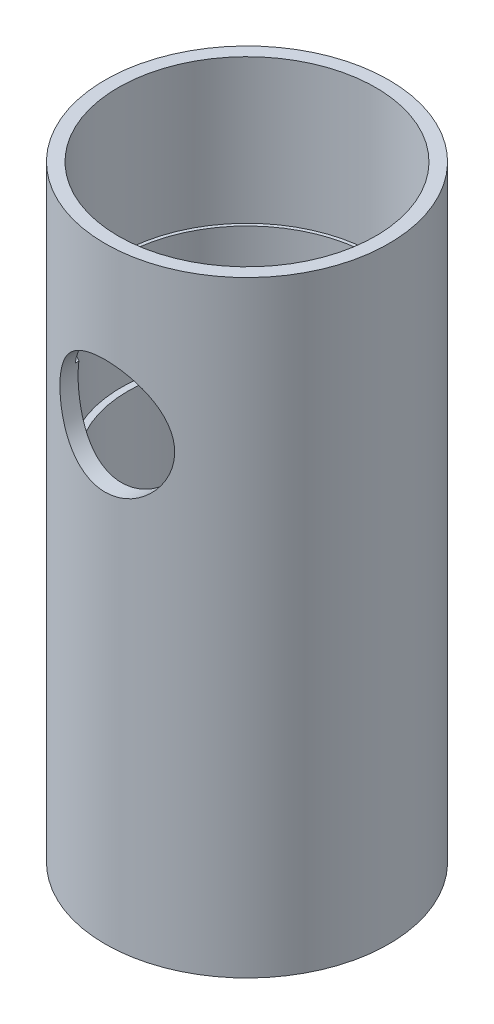
ISO-10303-21;
HEADER;
FILE_DESCRIPTION(('STEP AP214'),'2;1');
FILE_NAME('part.step','',(''),(''),'','','');
FILE_SCHEMA(('AUTOMOTIVE_DESIGN { 1 0 10303 214 1 1 1 1 }'));
ENDSEC;
DATA;
#1=APPLICATION_CONTEXT('core data for automotive mechanical design processes');
#2=APPLICATION_PROTOCOL_DEFINITION('international standard','automotive_design',2000,#1);
#3=PRODUCT_CONTEXT('',#1,'mechanical');
#4=PRODUCT('Part','Part','',(#3));
#5=PRODUCT_RELATED_PRODUCT_CATEGORY('part','',(#4));
#6=PRODUCT_DEFINITION_FORMATION('','',#4);
#7=PRODUCT_DEFINITION_CONTEXT('part definition',#1,'design');
#8=PRODUCT_DEFINITION('design','',#6,#7);
#9=PRODUCT_DEFINITION_SHAPE('','',#8);
#10=(LENGTH_UNIT() NAMED_UNIT(*) SI_UNIT(.MILLI.,.METRE.));
#11=(NAMED_UNIT(*) PLANE_ANGLE_UNIT() SI_UNIT($,.RADIAN.));
#12=(NAMED_UNIT(*) SI_UNIT($,.STERADIAN.) SOLID_ANGLE_UNIT());
#13=UNCERTAINTY_MEASURE_WITH_UNIT(LENGTH_MEASURE(1.E-05),#10,'distance_accuracy_value','');
#14=(GEOMETRIC_REPRESENTATION_CONTEXT(3) GLOBAL_UNCERTAINTY_ASSIGNED_CONTEXT((#13)) GLOBAL_UNIT_ASSIGNED_CONTEXT((#10,
#11,#12)) REPRESENTATION_CONTEXT('',''));
#15=CARTESIAN_POINT('',(0.,0.,0.));
#16=DIRECTION('',(0.,0.,1.));
#17=DIRECTION('',(1.,0.,0.));
#18=AXIS2_PLACEMENT_3D('',#15,#16,#17);
#19=CARTESIAN_POINT('',(0.,92.5,0.));
#20=DIRECTION('',(0.,-1.,0.));
#21=DIRECTION('',(0.,0.,-1.));
#22=AXIS2_PLACEMENT_3D('',#19,#20,#21);
#23=CYLINDRICAL_SURFACE('',#22,38.25);
#24=CARTESIAN_POINT('',(0.,13.85,0.));
#25=DIRECTION('',(0.,-1.,0.));
#26=DIRECTION('',(0.,0.,-1.));
#27=AXIS2_PLACEMENT_3D('',#24,#25,#26);
#28=CIRCLE('',#27,38.25);
#29=CARTESIAN_POINT('',(0.,13.85,-38.25));
#30=VERTEX_POINT('',#29);
#31=EDGE_CURVE('E90',#30,#30,#28,.T.);
#32=ORIENTED_EDGE('',*,*,#31,.T.);
#33=EDGE_LOOP('',(#32));
#34=FACE_BOUND('',#33,.T.);
#35=CARTESIAN_POINT('',(0.,48.5,0.));
#36=DIRECTION('',(0.,1.,0.));
#37=DIRECTION('',(0.,0.,1.));
#38=AXIS2_PLACEMENT_3D('',#35,#36,#37);
#39=CIRCLE('',#38,38.25);
#40=CARTESIAN_POINT('',(17.0008088042893,48.5,34.2641941390718));
#41=VERTEX_POINT('',#40);
#42=CARTESIAN_POINT('',(-17.0008088042893,48.5,34.2641941390718));
#43=VERTEX_POINT('',#42);
#44=EDGE_CURVE('E84',#41,#43,#39,.T.);
#45=ORIENTED_EDGE('',*,*,#44,.T.);
#46=CARTESIAN_POINT('',(-17.0008088042893,48.5,34.2641941390718));
#47=CARTESIAN_POINT('',(-17.053307658475,48.2849354779542,34.2381435848934));
#48=CARTESIAN_POINT('',(-17.1017703815142,48.0686850927902,34.2139501900393));
#49=CARTESIAN_POINT('',(-17.1905149308626,47.6341120665675,34.1694481465527));
#50=CARTESIAN_POINT('',(-17.2307965951209,47.4157893845503,34.1491395748714));
#51=CARTESIAN_POINT('',(-17.3391939806238,46.7582367167698,34.0943033376247));
#52=CARTESIAN_POINT('',(-17.3948769432476,46.3163613613227,34.0658577161328));
#53=CARTESIAN_POINT('',(-17.4722693404018,45.4302944303113,34.0262278013022));
#54=CARTESIAN_POINT('',(-17.4940826153484,44.9861141401189,34.014990750002));
#55=CARTESIAN_POINT('',(-17.5038171775729,44.0973048101313,34.0099826794918));
#56=CARTESIAN_POINT('',(-17.4917413164754,43.6526758112401,34.016210190714));
#57=CARTESIAN_POINT('',(-17.4338145053133,42.765756573535,34.0459345779966));
#58=CARTESIAN_POINT('',(-17.3879288553609,42.3234692080585,34.0694491962198));
#59=CARTESIAN_POINT('',(-17.2628744296219,41.4448138791733,34.1329835449892));
#60=CARTESIAN_POINT('',(-17.1837036101966,41.0084462809243,34.1730042889734));
#61=CARTESIAN_POINT('',(-16.9929258414245,40.1445013582464,34.2682698028966));
#62=CARTESIAN_POINT('',(-16.8813136165217,39.7169254756272,34.3235170488628));
#63=CARTESIAN_POINT('',(-16.6267632834821,38.8732385977085,34.4475435978451));
#64=CARTESIAN_POINT('',(-16.4838248517285,38.4571277208988,34.5163230406553));
#65=CARTESIAN_POINT('',(-16.1651306656347,37.6315376158535,34.6667363889519));
#66=CARTESIAN_POINT('',(-15.9888482766277,37.2222989186612,34.7485727210965));
#67=CARTESIAN_POINT('',(-15.6064856014758,36.4199828887646,34.9219725410941));
#68=CARTESIAN_POINT('',(-15.4003952968805,36.0269110470224,35.0135392965897));
#69=CARTESIAN_POINT('',(-14.9597746127656,35.2587246783528,35.2040516835182));
#70=CARTESIAN_POINT('',(-14.7252333700046,34.8836170873327,35.3030001278675));
#71=CARTESIAN_POINT('',(-14.2291408484609,34.1531122381153,35.5058567589881));
#72=CARTESIAN_POINT('',(-13.9675877126269,33.7977163376698,35.6097652864978));
#73=CARTESIAN_POINT('',(-13.3902222747479,33.0722049803065,35.8311275063851));
#74=CARTESIAN_POINT('',(-13.0715960042441,32.7044111751399,35.9488648585861));
#75=CARTESIAN_POINT('',(-12.4049785893923,31.9967524573306,36.1843046752592));
#76=CARTESIAN_POINT('',(-12.0569982968926,31.6568773143975,36.3020071366213));
#77=CARTESIAN_POINT('',(-11.3331480999331,31.00658966723,36.5344607320918));
#78=CARTESIAN_POINT('',(-10.9572600634305,30.6961966217081,36.6492098810396));
#79=CARTESIAN_POINT('',(-10.179907041982,30.1072056144364,36.8726927520938));
#80=CARTESIAN_POINT('',(-9.77845239401758,29.8285949281678,36.9814288725541));
#81=CARTESIAN_POINT('',(-8.9372107724763,29.2956674646876,37.1938647235533));
#82=CARTESIAN_POINT('',(-8.49656694811337,29.042573234301,37.2972460232827));
#83=CARTESIAN_POINT('',(-7.59272813345202,28.5747212242354,37.4916875416269));
#84=CARTESIAN_POINT('',(-7.12953232531777,28.3599648361779,37.5827473129546));
#85=CARTESIAN_POINT('',(-6.18401797061164,27.9710781432407,37.7498444293093));
#86=CARTESIAN_POINT('',(-5.70170893094741,27.7969279303925,37.8258891329526));
#87=CARTESIAN_POINT('',(-4.72145580067361,27.4911335297655,37.9607035929183));
#88=CARTESIAN_POINT('',(-4.22351317638151,27.3594853685916,38.0194749640292));
#89=CARTESIAN_POINT('',(-3.25240313375543,27.1482341474891,38.1143676489956));
#90=CARTESIAN_POINT('',(-2.78002976803506,27.0655687515312,38.1518140468948));
#91=CARTESIAN_POINT('',(-1.82904354982571,26.9392378759796,38.2092129443408));
#92=CARTESIAN_POINT('',(-1.35043099350861,26.8955705519537,38.2291662712299));
#93=CARTESIAN_POINT('',(-0.390986254751331,26.8477782069746,38.2510106768318));
#94=CARTESIAN_POINT('',(0.0898451285645738,26.8436399156774,38.2529078172102));
#95=CARTESIAN_POINT('',(1.0499393157405,26.8749237012639,38.2386008057896));
#96=CARTESIAN_POINT('',(1.52920217150788,26.910344455466,38.2223972591985));
#97=CARTESIAN_POINT('',(2.45182127379952,27.0167870428658,38.1739532384048));
#98=CARTESIAN_POINT('',(2.89551656590489,27.0853917843811,38.1428025818588));
#99=CARTESIAN_POINT('',(3.77507582412566,27.2561566037183,38.0658137103129));
#100=CARTESIAN_POINT('',(4.21094020216572,27.3583149110602,38.0199762702756));
#101=CARTESIAN_POINT('',(5.07205990229719,27.5951903216102,37.9147055894478));
#102=CARTESIAN_POINT('',(5.49731454289734,27.7299095103793,37.8552714777882));
#103=CARTESIAN_POINT('',(6.33465028591056,28.0306823545084,37.724187426682));
#104=CARTESIAN_POINT('',(6.74673087501375,28.1967372290869,37.65253701193));
#105=CARTESIAN_POINT('',(7.56722906376009,28.5640906181402,37.4963864340642));
#106=CARTESIAN_POINT('',(7.97518997425803,28.7662751614723,37.4115726593048));
#107=CARTESIAN_POINT('',(8.77257159703506,29.200803038743,37.2326667858936));
#108=CARTESIAN_POINT('',(9.16199211188469,29.4331466937363,37.1385745884723));
#109=CARTESIAN_POINT('',(9.920462389794,29.9264386839699,36.9432040768317));
#110=CARTESIAN_POINT('',(10.2895084623263,30.1873921760634,36.8419244682634));
#111=CARTESIAN_POINT('',(11.0055969343031,30.7363862271596,36.6343879472974));
#112=CARTESIAN_POINT('',(11.3526307034381,31.0244373016776,36.5281291107501));
#113=CARTESIAN_POINT('',(12.0514007554351,31.6514822562194,36.3038844379294));
#114=CARTESIAN_POINT('',(12.4010483415857,31.9927243815419,36.185667327808));
#115=CARTESIAN_POINT('',(13.0706172093886,32.7032290000104,35.9492358333471));
#116=CARTESIAN_POINT('',(13.3905376144867,33.0724923188239,35.8310214491907));
#117=CARTESIAN_POINT('',(13.9989407114712,33.8372236754821,35.5977296042384));
#118=CARTESIAN_POINT('',(14.2874130159301,34.2327003027419,35.4826531892806));
#119=CARTESIAN_POINT('',(14.8309997173997,35.047772414233,35.2589048929774));
#120=CARTESIAN_POINT('',(15.0861090577515,35.4673715407497,35.1502339838505));
#121=CARTESIAN_POINT('',(15.5683824467248,36.3417321055678,34.939367362949));
#122=CARTESIAN_POINT('',(15.7944389557166,36.7971795166681,34.8374756303952));
#123=CARTESIAN_POINT('',(16.2068398948384,37.7282604543039,34.6475454313125));
#124=CARTESIAN_POINT('',(16.3932031892248,38.2038842625157,34.5595003893526));
#125=CARTESIAN_POINT('',(16.7242618329952,39.1720921357527,34.4005134627231));
#126=CARTESIAN_POINT('',(16.8689679481781,39.6646717818354,34.3295671598624));
#127=CARTESIAN_POINT('',(17.1149020294832,40.6629581013979,34.2076240679525));
#128=CARTESIAN_POINT('',(17.2161368729638,41.1686626850171,34.1566241234102));
#129=CARTESIAN_POINT('',(17.3669123065925,42.1448103002928,34.0801897971872));
#130=CARTESIAN_POINT('',(17.4201523652447,42.6145418657875,34.0529327501744));
#131=CARTESIAN_POINT('',(17.4884391329691,43.5575658098823,34.0179144579244));
#132=CARTESIAN_POINT('',(17.5034825763138,44.0308584894805,34.010154879679));
#133=CARTESIAN_POINT('',(17.495170153445,44.9762367631149,34.0144311694162));
#134=CARTESIAN_POINT('',(17.4718754395241,45.4483230788277,34.0264355124444));
#135=CARTESIAN_POINT('',(17.3873217187934,46.3879762786799,34.0697198385377));
#136=CARTESIAN_POINT('',(17.3260849892227,46.8555456514072,34.100988510702));
#137=CARTESIAN_POINT('',(17.2121116657303,47.5176350763709,34.1585584494719));
#138=CARTESIAN_POINT('',(17.1745079542443,47.7155312439865,34.1774908392059));
#139=CARTESIAN_POINT('',(17.0926362884327,48.1092723068575,34.2185092300184));
#140=CARTESIAN_POINT('',(17.0483792639901,48.3051200131082,34.2405900559208));
#141=CARTESIAN_POINT('',(17.0008088042893,48.5,34.2641941390718));
#142=B_SPLINE_CURVE_WITH_KNOTS('',3,(#46,#47,#48,#49,#50,#51,#52,#53,#54,#55,#56,#57,#58,#59,
#60,#61,#62,#63,#64,#65,#66,#67,#68,#69,#70,#71,#72,#73,#74,#75,#76,#77,#78,#79,#80,#81,#82,#83,
#84,#85,#86,#87,#88,#89,#90,#91,#92,#93,#94,#95,#96,#97,#98,#99,#100,#101,#102,#103,#104,#105,
#106,#107,#108,#109,#110,#111,#112,#113,#114,#115,#116,#117,#118,#119,#120,#121,#122,#123,#124,
#125,#126,#127,#128,#129,#130,#131,#132,#133,#134,#135,#136,#137,#138,#139,#140,#141),
.UNSPECIFIED.,.F.,.F.,(4,2,2,2,2,2,2,2,2,2,2,2,2,2,2,2,2,2,2,2,2,2,2,2,2,2,2,2,2,2,2,2,2,2,2,2,
2,2,2,2,2,2,2,2,2,2,2,4),(0.,0.668624185006783,1.33726161285922,2.67434813861644,
4.00732716524454,5.34019403079537,6.67443076194051,8.00874942435118,9.34328519247991,
10.6778347477381,12.0355522387374,13.3937271240389,14.7524222346864,16.11121081706,
17.6115088712097,19.1112546927625,20.6119835934538,22.1121095314822,23.6657956600238,
25.2195381742038,26.7725173265876,28.3253512533266,29.7664959521713,31.207572487785,
32.6481652206734,34.0887097878787,35.4372914295982,36.7858019237924,38.1343988145036,
39.483048187664,40.8709989422968,42.2589644733725,43.6471805944283,45.0359376679571,
46.5422543513417,48.0486154368329,49.5554725811595,51.0625578483159,52.6162275358085,
54.1691571838055,55.7216851347007,57.2739673778463,58.692640322139,60.1114345557985,
61.527967896754,62.943670322774,63.550528057953,64.1563995427988),.UNSPECIFIED.);
#143=EDGE_CURVE('E55',#43,#41,#142,.T.);
#144=ORIENTED_EDGE('',*,*,#143,.T.);
#145=EDGE_LOOP('',(#45,#144));
#146=FACE_BOUND('',#145,.T.);
#147=ADVANCED_FACE('F39',(#34,#146),#23,.F.);
#148=CARTESIAN_POINT('',(0.,92.5,0.));
#149=DIRECTION('',(0.,-1.,0.));
#150=DIRECTION('',(0.,0.,-1.));
#151=AXIS2_PLACEMENT_3D('',#148,#149,#150);
#152=CYLINDRICAL_SURFACE('',#151,43.25);
#153=CARTESIAN_POINT('',(0.,92.5,0.));
#154=DIRECTION('',(0.,1.,0.));
#155=DIRECTION('',(0.,0.,1.));
#156=AXIS2_PLACEMENT_3D('',#153,#154,#155);
#157=CIRCLE('',#156,43.25);
#158=CARTESIAN_POINT('',(0.,92.5,43.25));
#159=VERTEX_POINT('',#158);
#160=EDGE_CURVE('E98',#159,#159,#157,.T.);
#161=ORIENTED_EDGE('',*,*,#160,.F.);
#162=EDGE_LOOP('',(#161));
#163=FACE_BOUND('',#162,.T.);
#164=CARTESIAN_POINT('',(0.,-92.5,0.));
#165=DIRECTION('',(0.,1.,0.));
#166=DIRECTION('',(0.,0.,1.));
#167=AXIS2_PLACEMENT_3D('',#164,#165,#166);
#168=CIRCLE('',#167,43.25);
#169=CARTESIAN_POINT('',(0.,-92.5,43.25));
#170=VERTEX_POINT('',#169);
#171=EDGE_CURVE('E97',#170,#170,#168,.T.);
#172=ORIENTED_EDGE('',*,*,#171,.T.);
#173=EDGE_LOOP('',(#172));
#174=FACE_BOUND('',#173,.T.);
#175=CARTESIAN_POINT('',(0.,26.85,43.25));
#176=CARTESIAN_POINT('',(0.470059434277367,26.850002844216,43.2499977648821));
#177=CARTESIAN_POINT('',(0.940294062765784,26.8689650815116,43.242315552243));
#178=CARTESIAN_POINT('',(1.87743082592684,26.9446417731731,43.211778779537));
#179=CARTESIAN_POINT('',(2.34433056223458,27.0013810792808,43.1889142317585));
#180=CARTESIAN_POINT('',(3.27227048018819,27.1522183293541,43.1285451481035));
#181=CARTESIAN_POINT('',(3.73329381704013,27.24640603052,43.0910054421133));
#182=CARTESIAN_POINT('',(4.64493934781961,27.4711689672634,43.0022881934933));
#183=CARTESIAN_POINT('',(5.09556320935262,27.6017383243465,42.9511128541476));
#184=CARTESIAN_POINT('',(5.98200699968892,27.8975472167294,42.8366335919219));
#185=CARTESIAN_POINT('',(6.41787076643722,28.062671242022,42.7733701371742));
#186=CARTESIAN_POINT('',(7.27364607323425,28.4264242902271,42.6361865097981));
#187=CARTESIAN_POINT('',(7.69355701410011,28.6250545701019,42.5622659373908));
#188=CARTESIAN_POINT('',(8.51473250296929,29.0541241803067,42.4056182956549));
#189=CARTESIAN_POINT('',(8.91600820300398,29.28454414988,42.3228965934096));
#190=CARTESIAN_POINT('',(9.69816737601017,29.7757448603038,42.1505457868008));
#191=CARTESIAN_POINT('',(10.0790428123304,30.0365374398211,42.0609139936476));
#192=CARTESIAN_POINT('',(10.8343968901387,30.5987437432511,41.8728593952449));
#193=CARTESIAN_POINT('',(11.2078742027632,30.9014320696689,41.7742237278819));
#194=CARTESIAN_POINT('',(11.9282904328624,31.536087355285,41.5742488793874));
#195=CARTESIAN_POINT('',(12.2752284239501,31.8680553356549,41.4729096040497));
#196=CARTESIAN_POINT('',(12.9407913246801,32.5594839715228,41.2700801175748));
#197=CARTESIAN_POINT('',(13.2594048230751,32.9189556000249,41.1685898622032));
#198=CARTESIAN_POINT('',(13.8663734349416,33.6633556892427,40.9681385478603));
#199=CARTESIAN_POINT('',(14.1547237412418,34.0482881785177,40.8691778925874));
#200=CARTESIAN_POINT('',(14.7118577265007,34.8597699571218,40.6720426858552));
#201=CARTESIAN_POINT('',(14.9791292444083,35.2874193633521,40.5741141137364));
#202=CARTESIAN_POINT('',(15.4763768145114,36.1654895559165,40.3870626977386));
#203=CARTESIAN_POINT('',(15.7063682359944,36.6159008573367,40.2979362310091));
#204=CARTESIAN_POINT('',(16.1271539384876,37.5366984820836,40.1313921632747));
#205=CARTESIAN_POINT('',(16.3179543644506,38.0070816599415,40.0539727271687));
#206=CARTESIAN_POINT('',(16.6584905254094,38.9645730845136,39.9135461941763));
#207=CARTESIAN_POINT('',(16.8082291220181,39.4516801630702,39.85053809301));
#208=CARTESIAN_POINT('',(17.05904913232,40.4161051724473,39.7437927605097));
#209=CARTESIAN_POINT('',(17.1620557454882,40.8928388462224,39.6993009203272));
#210=CARTESIAN_POINT('',(17.328026130822,41.8544935024117,39.627140145584));
#211=CARTESIAN_POINT('',(17.3909910786943,42.3394142440074,39.5994707170832));
#212=CARTESIAN_POINT('',(17.4761003471459,43.3133024504649,39.5619841425426));
#213=CARTESIAN_POINT('',(17.4982624769182,43.8022680562117,39.5521592079475));
#214=CARTESIAN_POINT('',(17.5015406934382,44.7803520513256,39.550709122454));
#215=CARTESIAN_POINT('',(17.4826587602059,45.2694704321846,39.5590830936164));
#216=CARTESIAN_POINT('',(17.4069126294781,46.2088429713542,39.5924666556732));
#217=CARTESIAN_POINT('',(17.3528654886494,46.6593717558863,39.616241887769));
#218=CARTESIAN_POINT('',(17.2101817936726,47.5538634614433,39.678434872842));
#219=CARTESIAN_POINT('',(17.1215471446506,47.9978267427071,39.7168518193313));
#220=CARTESIAN_POINT('',(16.9105484982901,48.8763072272052,39.8071474899506));
#221=CARTESIAN_POINT('',(16.7881801649869,49.310823208378,39.8590279445647));
#222=CARTESIAN_POINT('',(16.5108262606456,50.167681839503,39.9747128613793));
#223=CARTESIAN_POINT('',(16.3558394754305,50.5900240356373,40.0385177674413));
#224=CARTESIAN_POINT('',(16.0110002279462,51.4286761037803,40.1776757417442));
#225=CARTESIAN_POINT('',(15.8204951618841,51.8446823687218,40.2532396700456));
#226=CARTESIAN_POINT('',(15.4082820241698,52.6592245996199,40.4128218147288));
#227=CARTESIAN_POINT('',(15.1865738102807,53.0577604859284,40.4968400696483));
#228=CARTESIAN_POINT('',(14.7133734515888,53.8354567600271,40.6711533374526));
#229=CARTESIAN_POINT('',(14.4618722421681,54.21461120046,40.7614502571728));
#230=CARTESIAN_POINT('',(13.9306447464836,54.9515799217684,40.9460462107693));
#231=CARTESIAN_POINT('',(13.6509169661793,55.3093930714467,41.0403454563368));
#232=CARTESIAN_POINT('',(13.0414265505587,56.02951364981,41.2382629032203));
#233=CARTESIAN_POINT('',(12.7094537521764,56.3899136734192,41.3420256165127));
#234=CARTESIAN_POINT('',(12.016492967026,57.0815933228605,41.5487311593367));
#235=CARTESIAN_POINT('',(11.6555164524246,57.4128843550012,41.6516742955086));
#236=CARTESIAN_POINT('',(10.9063084669352,58.0446203183379,41.8540982974705));
#237=CARTESIAN_POINT('',(10.5180651622934,58.3450517154518,41.9535776316081));
#238=CARTESIAN_POINT('',(9.71667748219643,58.9128752070573,42.1463937721416));
#239=CARTESIAN_POINT('',(9.30353322224621,59.1802674547862,42.2397306070256));
#240=CARTESIAN_POINT('',(8.44596708696947,59.6851985955382,42.4196180657154));
#241=CARTESIAN_POINT('',(8.00107428827262,59.9220034894991,42.5059878411286));
#242=CARTESIAN_POINT('',(7.09078391371717,60.3570372814059,42.6672815337763));
#243=CARTESIAN_POINT('',(6.62538585991635,60.5552652796069,42.7422051840391));
#244=CARTESIAN_POINT('',(5.67759167941602,60.9111312833959,42.8783924764108));
#245=CARTESIAN_POINT('',(5.19520279315624,61.0687863463359,42.9396618574823));
#246=CARTESIAN_POINT('',(4.21695657454258,61.3419130834324,43.0467397188671));
#247=CARTESIAN_POINT('',(3.72110020200849,61.4573877553292,43.0925492978836));
#248=CARTESIAN_POINT('',(2.75020559605458,61.6391693672073,43.1650481182577));
#249=CARTESIAN_POINT('',(2.27571658022924,61.7080226662511,43.1927242964743));
#250=CARTESIAN_POINT('',(1.32204201876229,61.8065738855666,43.2324232768283));
#251=CARTESIAN_POINT('',(0.842856662639652,61.8362733793736,43.2444467080269));
#252=CARTESIAN_POINT('',(-0.11635463992812,61.8561857342567,43.2525023411747));
#253=CARTESIAN_POINT('',(-0.596380365922483,61.8464077413418,43.2485382470592));
#254=CARTESIAN_POINT('',(-1.55360698058765,61.7874949093837,43.2247382862753));
#255=CARTESIAN_POINT('',(-2.03080792552574,61.7383608569562,43.2049027368322));
#256=CARTESIAN_POINT('',(-2.95673378052892,61.6044582525519,43.1511908786069));
#257=CARTESIAN_POINT('',(-3.40575429504911,61.5214445609101,43.118007041868));
#258=CARTESIAN_POINT('',(-4.2948181443191,61.3209218495559,43.0385434003731));
#259=CARTESIAN_POINT('',(-4.73486182570271,61.2034141645105,42.9922641023187));
#260=CARTESIAN_POINT('',(-5.6031887580431,60.9349576580756,42.8877377037914));
#261=CARTESIAN_POINT('',(-6.03147109833955,60.7840062553564,42.8294896795458));
#262=CARTESIAN_POINT('',(-6.87367471807431,60.4499331227533,42.7024178840039));
#263=CARTESIAN_POINT('',(-7.28759548814101,60.266810253216,42.6335937380661));
#264=CARTESIAN_POINT('',(-8.11120757133792,59.8637013041062,42.4847181864237));
#265=CARTESIAN_POINT('',(-8.52037852079317,59.6427557671346,42.4043868747247));
#266=CARTESIAN_POINT('',(-9.31870866519969,59.1698158329657,42.2361292412104));
#267=CARTESIAN_POINT('',(-9.7078675870692,58.9178210122328,42.148202815797));
#268=CARTESIAN_POINT('',(-10.4642029711473,58.3844091352346,41.9668230084931));
#269=CARTESIAN_POINT('',(-10.8313754583454,58.1029867837612,41.8733686332185));
#270=CARTESIAN_POINT('',(-11.5419259587758,57.5123505490372,41.6831115687275));
#271=CARTESIAN_POINT('',(-11.885295397412,57.2031267420319,41.5863076915489));
#272=CARTESIAN_POINT('',(-12.5686708075017,56.5369312254383,41.3850974807289));
#273=CARTESIAN_POINT('',(-12.9068899517914,56.1781460020152,41.2806185295181));
#274=CARTESIAN_POINT('',(-13.5520961351205,55.4330315158437,41.073325245266));
#275=CARTESIAN_POINT('',(-13.8590812685067,55.0467005749155,40.9705110141142));
#276=CARTESIAN_POINT('',(-14.4399610535917,54.2485465391662,40.7694070429601));
#277=CARTESIAN_POINT('',(-14.7138427053217,53.8367135248977,40.6711190897773));
#278=CARTESIAN_POINT('',(-15.2263283875827,52.9902320251574,40.4820456971393));
#279=CARTESIAN_POINT('',(-15.4649465553332,52.5555927779774,40.3912572575834));
#280=CARTESIAN_POINT('',(-15.9075853310841,51.660987814311,40.2190041915652));
#281=CARTESIAN_POINT('',(-16.1111893612872,51.2007932934099,40.1376551394432));
#282=CARTESIAN_POINT('',(-16.4785976805825,50.2626615901637,39.9882194615447));
#283=CARTESIAN_POINT('',(-16.6424013835439,49.7847241466418,39.9201330310867));
#284=CARTESIAN_POINT('',(-16.9283732359771,48.8149269365687,39.7997082344541));
#285=CARTESIAN_POINT('',(-17.0505678719415,48.3230762433826,39.7473598526283));
#286=CARTESIAN_POINT('',(-17.2520102640288,47.3291272372655,39.6603421243688));
#287=CARTESIAN_POINT('',(-17.3312617351412,46.8270298146743,39.6256712486793));
#288=CARTESIAN_POINT('',(-17.4416112219965,45.8540117934851,39.577215905536));
#289=CARTESIAN_POINT('',(-17.475817182458,45.3835084238347,39.5620849711273));
#290=CARTESIAN_POINT('',(-17.5061121131864,44.4410460469658,39.5486894074129));
#291=CARTESIAN_POINT('',(-17.502203029631,43.9690871152992,39.5504239169474));
#292=CARTESIAN_POINT('',(-17.4563185034596,43.0274539859397,39.5706969814816));
#293=CARTESIAN_POINT('',(-17.4143477435348,42.5577795143379,39.5892334693502));
#294=CARTESIAN_POINT('',(-17.2928270893453,41.6242546690589,39.6424648284504));
#295=CARTESIAN_POINT('',(-17.2132774009697,41.1604042634868,39.6771596111532));
#296=CARTESIAN_POINT('',(-17.0215379900631,40.2610112499345,39.7597804030315));
#297=CARTESIAN_POINT('',(-16.9108404084966,39.8250928841698,39.8070973271153));
#298=CARTESIAN_POINT('',(-16.65675359561,38.9644766117882,39.9140832510825));
#299=CARTESIAN_POINT('',(-16.5133655575087,38.5397782962648,39.9737518001177));
#300=CARTESIAN_POINT('',(-16.1950943522642,37.704032465471,40.1037522229892));
#301=CARTESIAN_POINT('',(-16.0202096486718,37.2929856172964,40.1740846169956));
#302=CARTESIAN_POINT('',(-15.6402019215587,36.4866142793651,40.323544784181));
#303=CARTESIAN_POINT('',(-15.4350679038814,36.0912955726383,40.4026757526318));
#304=CARTESIAN_POINT('',(-14.9832551308622,35.2960996129921,40.5724797337683));
#305=CARTESIAN_POINT('',(-14.7348584529602,34.897284097535,40.6635557748369));
#306=CARTESIAN_POINT('',(-14.207459510504,34.1217039644758,40.8508124733559));
#307=CARTESIAN_POINT('',(-13.92845624186,33.7449400709286,40.9469932982221));
#308=CARTESIAN_POINT('',(-13.3413875548945,33.0152418045547,41.1420170461912));
#309=CARTESIAN_POINT('',(-13.033309791695,32.6623176640744,41.2408610872392));
#310=CARTESIAN_POINT('',(-12.389993249649,31.9824196584947,41.4386748481155));
#311=CARTESIAN_POINT('',(-12.0547626320578,31.6554380539841,41.5376445214441));
#312=CARTESIAN_POINT('',(-11.3353786570621,31.0080053623813,41.7399147344887));
#313=CARTESIAN_POINT('',(-10.9494513062316,30.689472782613,41.8430588332582));
#314=CARTESIAN_POINT('',(-10.1508056809915,30.0860011681566,42.0439434678828));
#315=CARTESIAN_POINT('',(-9.7380858100794,29.8010641382015,42.1416836810896));
#316=CARTESIAN_POINT('',(-8.88813320582471,29.2667917404913,42.3291039645086));
#317=CARTESIAN_POINT('',(-8.45088746124003,29.0174755235444,42.4187796894837));
#318=CARTESIAN_POINT('',(-7.5549168297853,28.5567436990427,42.5874802506419));
#319=CARTESIAN_POINT('',(-7.09619373624044,28.3453249342024,42.6665059739542));
#320=CARTESIAN_POINT('',(-6.16888932226307,27.9658242773945,42.8103192210252));
#321=CARTESIAN_POINT('',(-5.70063719331078,27.7970266103111,42.8753387708321));
#322=CARTESIAN_POINT('',(-4.74971895872984,27.4995296108421,42.9910694239837));
#323=CARTESIAN_POINT('',(-4.26705039778131,27.370837152102,43.0417780744381));
#324=CARTESIAN_POINT('',(-3.29253697619322,27.1553038258687,43.1272572015762));
#325=CARTESIAN_POINT('',(-2.80072207409972,27.068345121127,43.1620725400378));
#326=CARTESIAN_POINT('',(-1.8108158092363,26.9367889948241,43.2149135081823));
#327=CARTESIAN_POINT('',(-1.31272944388052,26.8921597704104,43.2329517425886));
#328=CARTESIAN_POINT('',(-0.678186142356631,26.8626187897994,43.2448956552269));
#329=CARTESIAN_POINT('',(-0.542603421824429,26.8578878531542,43.2468089024352));
#330=CARTESIAN_POINT('',(-0.271351999916113,26.8515780473008,43.2493613975927));
#331=CARTESIAN_POINT('',(-0.135683298514898,26.8499991790132,43.2500006451698));
#332=CARTESIAN_POINT('',(0.,26.85,43.25));
#333=B_SPLINE_CURVE_WITH_KNOTS('',3,(#175,#176,#177,#178,#179,#180,#181,#182,#183,#184,#185,
#186,#187,#188,#189,#190,#191,#192,#193,#194,#195,#196,#197,#198,#199,#200,#201,#202,#203,#204,
#205,#206,#207,#208,#209,#210,#211,#212,#213,#214,#215,#216,#217,#218,#219,#220,#221,#222,#223,
#224,#225,#226,#227,#228,#229,#230,#231,#232,#233,#234,#235,#236,#237,#238,#239,#240,#241,#242,
#243,#244,#245,#246,#247,#248,#249,#250,#251,#252,#253,#254,#255,#256,#257,#258,#259,#260,#261,
#262,#263,#264,#265,#266,#267,#268,#269,#270,#271,#272,#273,#274,#275,#276,#277,#278,#279,#280,
#281,#282,#283,#284,#285,#286,#287,#288,#289,#290,#291,#292,#293,#294,#295,#296,#297,#298,#299,
#300,#301,#302,#303,#304,#305,#306,#307,#308,#309,#310,#311,#312,#313,#314,#315,#316,#317,#318,
#319,#320,#321,#322,#323,#324,#325,#326,#327,#328,#329,#330,#331,#332),.UNSPECIFIED.,.T.,.F.,(4,
2,2,2,2,2,2,2,2,2,2,2,2,2,2,2,2,2,2,2,2,2,2,2,2,2,2,2,2,2,2,2,2,2,2,2,2,2,2,2,2,2,2,2,2,2,2,2,2,
2,2,2,2,2,2,2,2,2,2,2,2,2,2,2,2,2,2,2,2,2,2,2,2,2,2,2,2,2,4),(0.,1.41003924077488,
2.82100699721751,4.23537718077374,5.64951896487065,7.0590069558035,8.4685478344061,
9.87723402424711,11.2864711425781,12.7570940385578,14.2277682449995,15.6990322902275,
17.1705296865129,18.7097780994274,20.2483903108289,21.7867610910347,23.3250246343991,
24.792359692957,26.2596516655098,27.7263030576375,29.1928836981261,30.5544309528383,
31.9159032222972,33.277550570484,34.6392486130907,36.0290043788645,37.4187664799242,
38.8089525120117,40.1992121656809,41.7000831713304,43.200363415752,44.7012988523331,
46.2022273272429,47.7342785464306,49.266365494007,50.7978072776178,52.3291402012052,
53.7680719896949,55.2069459478126,56.6454865716691,58.083998443916,59.4559195729871,
60.827787625669,62.1997616019336,63.5717841892957,64.9859465260284,66.400128155135,
67.8145646922908,69.2295081336958,70.7398268712683,72.2502377013995,73.7612397664135,
75.2716344139286,76.7989134437737,78.3262149641634,79.8525424464822,81.3787378659637,
82.7928916033446,84.2069731335422,85.6208807142639,87.0347805484984,88.3899828197027,
89.7451356332336,91.100354570842,92.4560672843107,93.8902891456858,95.3245580726884,
96.7594387463631,98.1938897311849,99.7248227455668,101.255847068483,102.787691442936,
104.319408138087,105.823373259556,107.327596004544,108.827546145633,110.326368454108,
110.733378090325,111.140387845417),.UNSPECIFIED.);
#334=CARTESIAN_POINT('',(0.,26.85,43.25));
#335=VERTEX_POINT('',#334);
#336=EDGE_CURVE('E141',#335,#335,#333,.T.);
#337=ORIENTED_EDGE('',*,*,#336,.F.);
#338=EDGE_LOOP('',(#337));
#339=FACE_BOUND('',#338,.T.);
#340=ADVANCED_FACE('F41',(#163,#174,#339),#152,.T.);
#341=CARTESIAN_POINT('',(0.,48.5,0.));
#342=DIRECTION('',(0.,1.,0.));
#343=DIRECTION('',(0.,0.,1.));
#344=AXIS2_PLACEMENT_3D('',#341,#342,#343);
#345=CYLINDRICAL_SURFACE('',#344,39.25);
#346=CARTESIAN_POINT('',(0.,92.5,0.));
#347=DIRECTION('',(0.,1.,0.));
#348=DIRECTION('',(0.,0.,1.));
#349=AXIS2_PLACEMENT_3D('',#346,#347,#348);
#350=CIRCLE('',#349,39.25);
#351=CARTESIAN_POINT('',(0.,92.5,39.25));
#352=VERTEX_POINT('',#351);
#353=EDGE_CURVE('E78',#352,#352,#350,.T.);
#354=ORIENTED_EDGE('',*,*,#353,.T.);
#355=EDGE_LOOP('',(#354));
#356=FACE_BOUND('',#355,.T.);
#357=CARTESIAN_POINT('',(-17.0008088042893,48.5,35.3770405771879));
#358=CARTESIAN_POINT('',(-16.9423198544225,48.7396066617131,35.4051448154363));
#359=CARTESIAN_POINT('',(-16.8788334042754,48.9776912754359,35.4354788642185));
#360=CARTESIAN_POINT('',(-16.742047905614,49.450429814747,35.50031139671));
#361=CARTESIAN_POINT('',(-16.6687496677721,49.6850840219886,35.5348095363493));
#362=CARTESIAN_POINT('',(-16.4345258527946,50.3829906122646,35.6440539431954));
#363=CARTESIAN_POINT('',(-16.2591726659128,50.8405892526174,35.7245982257521));
#364=CARTESIAN_POINT('',(-15.8723838532961,51.736120618749,35.8981151851715));
#365=CARTESIAN_POINT('',(-15.6610515764027,52.1741052564262,35.9910521032843));
#366=CARTESIAN_POINT('',(-15.2037230658565,53.0294000161558,36.1866154008));
#367=CARTESIAN_POINT('',(-14.9577216140369,53.4467070131483,36.2892432380449));
#368=CARTESIAN_POINT('',(-14.433441349801,54.2574909576772,36.500931511558));
#369=CARTESIAN_POINT('',(-14.155230276679,54.6510153596998,36.60997821915));
#370=CARTESIAN_POINT('',(-13.5679029138179,55.4131575965007,36.831684929954));
#371=CARTESIAN_POINT('',(-13.2587878648622,55.7817764302336,36.944344787976));
#372=CARTESIAN_POINT('',(-12.6110902260716,56.4925614769012,37.1704270708151));
#373=CARTESIAN_POINT('',(-12.2724803109283,56.8347025936092,37.2838501109708));
#374=CARTESIAN_POINT('',(-11.5678343058112,57.4902734839412,37.5084583102947));
#375=CARTESIAN_POINT('',(-11.2017982105518,57.803703252032,37.6196434690318));
#376=CARTESIAN_POINT('',(-10.4260552245811,58.4142269800789,37.8421767201092));
#377=CARTESIAN_POINT('',(-10.0150972334492,58.709824109919,37.9532785961813));
#378=CARTESIAN_POINT('',(-9.16750354021124,59.265213508468,38.1668752893493));
#379=CARTESIAN_POINT('',(-8.73086693116726,59.5250045114629,38.2693698021329));
#380=CARTESIAN_POINT('',(-7.83482115754633,60.0064401231255,38.4628136558129));
#381=CARTESIAN_POINT('',(-7.37542165478379,60.2281007407553,38.5537678376633));
#382=CARTESIAN_POINT('',(-6.43681985849778,60.631221148638,38.721532125454));
#383=CARTESIAN_POINT('',(-5.95761887997706,60.8126836033494,38.7983431687883));
#384=CARTESIAN_POINT('',(-5.00486163313138,61.1262175445954,38.9324390649837));
#385=CARTESIAN_POINT('',(-4.53201574480019,61.2601388646893,38.9904450322978));
#386=CARTESIAN_POINT('',(-3.57505441518071,61.4879949082957,39.0898047971203));
#387=CARTESIAN_POINT('',(-3.09093925367973,61.5819306234344,39.1311590075838));
#388=CARTESIAN_POINT('',(-2.11554194759396,61.7286537920588,39.1959918009201));
#389=CARTESIAN_POINT('',(-1.62426308405868,61.7814595156245,39.2194783205728));
#390=CARTESIAN_POINT('',(-0.638475121784164,61.8453212667015,39.2479035385077));
#391=CARTESIAN_POINT('',(-0.143966219013069,61.8563798038956,39.2528433517475));
#392=CARTESIAN_POINT('',(0.806181298018306,61.837375257756,39.2443724336309));
#393=CARTESIAN_POINT('',(1.26189746460909,61.8103954404662,39.2323375824297));
#394=CARTESIAN_POINT('',(2.169133321601,61.7210275529563,39.1926458587383));
#395=CARTESIAN_POINT('',(2.62065326016618,61.6586415903671,39.1649899161293));
#396=CARTESIAN_POINT('',(3.5163034228597,61.4991262230519,39.0947555648498));
#397=CARTESIAN_POINT('',(3.96043387922002,61.4019979123531,39.0521776260697));
#398=CARTESIAN_POINT('',(4.83835264534472,61.1739722685264,38.9531513950722));
#399=CARTESIAN_POINT('',(5.27214070369873,61.0430741154096,38.8967027660525));
#400=CARTESIAN_POINT('',(6.12675074920361,60.7486963670457,38.7712782407127));
#401=CARTESIAN_POINT('',(6.547569592093,60.585208941482,38.7022993340614));
#402=CARTESIAN_POINT('',(7.37370143332653,60.2270661731316,38.5534332237026));
#403=CARTESIAN_POINT('',(7.77901457695852,60.0324111224731,38.4735461222365));
#404=CARTESIAN_POINT('',(8.57213959267246,59.6133439558031,38.3046393040549));
#405=CARTESIAN_POINT('',(8.95994519448571,59.3889212901791,38.2156163521463));
#406=CARTESIAN_POINT('',(9.71602996368468,58.9118886969737,38.0304192949636));
#407=CARTESIAN_POINT('',(10.0843077768465,58.6592768182727,37.9342446948412));
#408=CARTESIAN_POINT('',(10.8263823830142,58.1075032849778,37.7294441155442));
#409=CARTESIAN_POINT('',(11.1985343822015,57.8062735969417,37.620424760356));
#410=CARTESIAN_POINT('',(11.9164139301425,57.1748824757891,37.399233760066));
#411=CARTESIAN_POINT('',(12.262140713851,56.8447202056291,37.2870620238271));
#412=CARTESIAN_POINT('',(12.9253279928511,56.1573665395478,37.0623927173843));
#413=CARTESIAN_POINT('',(13.2427942806528,55.8001807104977,36.9498952188549));
#414=CARTESIAN_POINT('',(13.8478354777371,55.0605453448593,36.7274267961783));
#415=CARTESIAN_POINT('',(14.135407583634,54.6780934443859,36.6174561097399));
#416=CARTESIAN_POINT('',(14.7056396721457,53.8510818962499,36.39243925098));
#417=CARTESIAN_POINT('',(14.985039837527,53.4041122600426,36.2779563024776));
#418=CARTESIAN_POINT('',(15.5032982798971,52.4848737144865,36.0595252608746));
#419=CARTESIAN_POINT('',(15.7421603376185,52.0126071698309,35.955576185711));
#420=CARTESIAN_POINT('',(16.1777468577889,51.0442562150113,35.7617127040844));
#421=CARTESIAN_POINT('',(16.3743365345641,50.5481016164692,35.6718434312758));
#422=CARTESIAN_POINT('',(16.6351566563545,49.7899588273507,35.5505729281271));
#423=CARTESIAN_POINT('',(16.7164495716733,49.5348025319053,35.5123901930806));
#424=CARTESIAN_POINT('',(16.8674097166867,49.0203684609185,35.4409352772102));
#425=CARTESIAN_POINT('',(16.9370757370171,48.7610902597078,35.4076636072493));
#426=CARTESIAN_POINT('',(17.0008088042893,48.5,35.3770405771879));
#427=B_SPLINE_CURVE_WITH_KNOTS('',3,(#357,#358,#359,#360,#361,#362,#363,#364,#365,#366,#367,
#368,#369,#370,#371,#372,#373,#374,#375,#376,#377,#378,#379,#380,#381,#382,#383,#384,#385,#386,
#387,#388,#389,#390,#391,#392,#393,#394,#395,#396,#397,#398,#399,#400,#401,#402,#403,#404,#405,
#406,#407,#408,#409,#410,#411,#412,#413,#414,#415,#416,#417,#418,#419,#420,#421,#422,#423,#424,
#425,#426),.UNSPECIFIED.,.F.,.F.,(4,2,2,2,2,2,2,2,2,2,2,2,2,2,2,2,2,2,2,2,2,2,2,2,2,2,2,2,2,2,2,
2,2,2,4),(0.,0.744575247864514,1.48908901513953,2.97687024173254,4.4604478232463,
5.94424894164636,7.42498433772741,8.90566030667141,10.3877229317494,11.8697858424484,
13.422686290246,14.9756416175897,16.5279433400848,18.0801421404164,19.562740552615,
21.0453021948534,22.5272049020741,24.0090185214889,25.3773914933887,26.7456830183378,
28.1139314599511,29.4822131280822,30.8508239542532,32.2194219534471,33.5885062848255,
34.9576854363782,36.4291986302652,37.900754410298,39.3720078699627,40.8433991750858,
42.459384608993,44.0752192472531,45.6961319955802,46.5073534568681,47.3186592443412),.UNSPECIFIED.);
#428=CARTESIAN_POINT('',(-17.0008088042893,48.5,35.3770405771879));
#429=VERTEX_POINT('',#428);
#430=CARTESIAN_POINT('',(17.0008088042893,48.5,35.3770405771879));
#431=VERTEX_POINT('',#430);
#432=EDGE_CURVE('E65',#429,#431,#427,.T.);
#433=ORIENTED_EDGE('',*,*,#432,.F.);
#434=CARTESIAN_POINT('',(0.,48.5,0.));
#435=DIRECTION('',(0.,1.,0.));
#436=DIRECTION('',(0.,0.,1.));
#437=AXIS2_PLACEMENT_3D('',#434,#435,#436);
#438=CIRCLE('',#437,39.25);
#439=EDGE_CURVE('E74',#431,#429,#438,.T.);
#440=ORIENTED_EDGE('',*,*,#439,.F.);
#441=EDGE_LOOP('',(#433,#440));
#442=FACE_BOUND('',#441,.T.);
#443=ADVANCED_FACE('F73',(#356,#442),#345,.F.);
#444=CARTESIAN_POINT('',(0.,48.5,0.));
#445=DIRECTION('',(0.,1.,0.));
#446=DIRECTION('',(0.,0.,1.));
#447=AXIS2_PLACEMENT_3D('',#444,#445,#446);
#448=PLANE('',#447);
#449=ORIENTED_EDGE('',*,*,#44,.F.);
#450=DIRECTION('',(0.,0.,-1.));
#451=VECTOR('',#450,1.);
#452=CARTESIAN_POINT('',(17.0008088042893,48.5,43.25));
#453=LINE('',#452,#451);
#454=EDGE_CURVE('E11',#41,#431,#453,.F.);
#455=ORIENTED_EDGE('',*,*,#454,.T.);
#456=ORIENTED_EDGE('',*,*,#439,.T.);
#457=DIRECTION('',(0.,0.,-1.));
#458=VECTOR('',#457,1.);
#459=CARTESIAN_POINT('',(-17.0008088042893,48.5,43.25));
#460=LINE('',#459,#458);
#461=EDGE_CURVE('E48',#429,#43,#460,.T.);
#462=ORIENTED_EDGE('',*,*,#461,.T.);
#463=EDGE_LOOP('',(#449,#455,#456,#462));
#464=FACE_BOUND('',#463,.T.);
#465=ADVANCED_FACE('F76',(#464),#448,.T.);
#466=CARTESIAN_POINT('',(0.,92.5,0.));
#467=DIRECTION('',(0.,1.,0.));
#468=DIRECTION('',(0.,0.,1.));
#469=AXIS2_PLACEMENT_3D('',#466,#467,#468);
#470=PLANE('',#469);
#471=ORIENTED_EDGE('',*,*,#353,.F.);
#472=EDGE_LOOP('',(#471));
#473=FACE_BOUND('',#472,.T.);
#474=ORIENTED_EDGE('',*,*,#160,.T.);
#475=EDGE_LOOP('',(#474));
#476=FACE_BOUND('',#475,.T.);
#477=ADVANCED_FACE('F117',(#473,#476),#470,.T.);
#478=CARTESIAN_POINT('',(0.,-92.5,0.));
#479=DIRECTION('',(0.,1.,0.));
#480=DIRECTION('',(0.,0.,1.));
#481=AXIS2_PLACEMENT_3D('',#478,#479,#480);
#482=PLANE('',#481);
#483=ORIENTED_EDGE('',*,*,#171,.F.);
#484=EDGE_LOOP('',(#483));
#485=FACE_BOUND('',#484,.T.);
#486=CARTESIAN_POINT('',(0.,-92.5,0.));
#487=DIRECTION('',(0.,1.,0.));
#488=DIRECTION('',(0.,0.,1.));
#489=AXIS2_PLACEMENT_3D('',#486,#487,#488);
#490=CIRCLE('',#489,38.25);
#491=CARTESIAN_POINT('',(0.,-92.5,38.25));
#492=VERTEX_POINT('',#491);
#493=EDGE_CURVE('E94',#492,#492,#490,.T.);
#494=ORIENTED_EDGE('',*,*,#493,.T.);
#495=EDGE_LOOP('',(#494));
#496=FACE_BOUND('',#495,.T.);
#497=ADVANCED_FACE('F112',(#485,#496),#482,.F.);
#498=CARTESIAN_POINT('',(0.,-86.15,0.));
#499=DIRECTION('',(0.,-1.,0.));
#500=DIRECTION('',(0.,0.,-1.));
#501=AXIS2_PLACEMENT_3D('',#498,#499,#500);
#502=CIRCLE('',#501,38.25);
#503=CARTESIAN_POINT('',(0.,-86.15,-38.25));
#504=VERTEX_POINT('',#503);
#505=EDGE_CURVE('E70',#504,#504,#502,.T.);
#506=ORIENTED_EDGE('',*,*,#505,.F.);
#507=EDGE_LOOP('',(#506));
#508=FACE_BOUND('',#507,.T.);
#509=ORIENTED_EDGE('',*,*,#493,.F.);
#510=EDGE_LOOP('',(#509));
#511=FACE_BOUND('',#510,.T.);
#512=ADVANCED_FACE('F108',(#508,#511),#23,.F.);
#513=CARTESIAN_POINT('',(0.,13.85,0.));
#514=DIRECTION('',(0.,-1.,0.));
#515=DIRECTION('',(0.,0.,-1.));
#516=AXIS2_PLACEMENT_3D('',#513,#514,#515);
#517=PLANE('',#516);
#518=CARTESIAN_POINT('',(0.,13.85,0.));
#519=DIRECTION('',(0.,-1.,0.));
#520=DIRECTION('',(0.,0.,-1.));
#521=AXIS2_PLACEMENT_3D('',#518,#519,#520);
#522=CIRCLE('',#521,36.25);
#523=CARTESIAN_POINT('',(0.,13.85,-36.25));
#524=VERTEX_POINT('',#523);
#525=EDGE_CURVE('E81',#524,#524,#522,.T.);
#526=ORIENTED_EDGE('',*,*,#525,.T.);
#527=EDGE_LOOP('',(#526));
#528=FACE_BOUND('',#527,.T.);
#529=ORIENTED_EDGE('',*,*,#31,.F.);
#530=EDGE_LOOP('',(#529));
#531=FACE_BOUND('',#530,.T.);
#532=ADVANCED_FACE('F111',(#528,#531),#517,.F.);
#533=CARTESIAN_POINT('',(0.,-86.15,0.));
#534=DIRECTION('',(0.,-1.,0.));
#535=DIRECTION('',(0.,0.,-1.));
#536=AXIS2_PLACEMENT_3D('',#533,#534,#535);
#537=PLANE('',#536);
#538=CARTESIAN_POINT('',(0.,-86.15,0.));
#539=DIRECTION('',(0.,-1.,0.));
#540=DIRECTION('',(0.,0.,-1.));
#541=AXIS2_PLACEMENT_3D('',#538,#539,#540);
#542=CIRCLE('',#541,36.25);
#543=CARTESIAN_POINT('',(0.,-86.15,-36.25));
#544=VERTEX_POINT('',#543);
#545=EDGE_CURVE('E77',#544,#544,#542,.T.);
#546=ORIENTED_EDGE('',*,*,#545,.F.);
#547=EDGE_LOOP('',(#546));
#548=FACE_BOUND('',#547,.T.);
#549=ORIENTED_EDGE('',*,*,#505,.T.);
#550=EDGE_LOOP('',(#549));
#551=FACE_BOUND('',#550,.T.);
#552=ADVANCED_FACE('F106',(#548,#551),#537,.T.);
#553=CARTESIAN_POINT('',(0.,13.85,0.));
#554=DIRECTION('',(0.,-1.,0.));
#555=DIRECTION('',(0.,0.,-1.));
#556=AXIS2_PLACEMENT_3D('',#553,#554,#555);
#557=CYLINDRICAL_SURFACE('',#556,36.25);
#558=ORIENTED_EDGE('',*,*,#525,.F.);
#559=EDGE_LOOP('',(#558));
#560=FACE_BOUND('',#559,.T.);
#561=ORIENTED_EDGE('',*,*,#545,.T.);
#562=EDGE_LOOP('',(#561));
#563=FACE_BOUND('',#562,.T.);
#564=ADVANCED_FACE('F153',(#560,#563),#557,.F.);
#565=CARTESIAN_POINT('',(0.,44.35,43.25));
#566=DIRECTION('',(0.,0.,-1.));
#567=DIRECTION('',(-1.,0.,0.));
#568=AXIS2_PLACEMENT_3D('',#565,#566,#567);
#569=CYLINDRICAL_SURFACE('',#568,17.5);
#570=ORIENTED_EDGE('',*,*,#143,.F.);
#571=ORIENTED_EDGE('',*,*,#461,.F.);
#572=ORIENTED_EDGE('',*,*,#432,.T.);
#573=ORIENTED_EDGE('',*,*,#454,.F.);
#574=EDGE_LOOP('',(#570,#571,#572,#573));
#575=FACE_BOUND('',#574,.T.);
#576=ORIENTED_EDGE('',*,*,#336,.T.);
#577=EDGE_LOOP('',(#576));
#578=FACE_BOUND('',#577,.T.);
#579=ADVANCED_FACE('F63',(#575,#578),#569,.F.);
#580=CLOSED_SHELL('',(#147,#340,#443,#465,#477,#497,#512,#532,#552,#564,#579));
#581=MANIFOLD_SOLID_BREP('B2',#580);
#582=ADVANCED_BREP_SHAPE_REPRESENTATION('',(#18,#581),#14);
#583=SHAPE_DEFINITION_REPRESENTATION(#9,#582);
ENDSEC;
END-ISO-10303-21;
